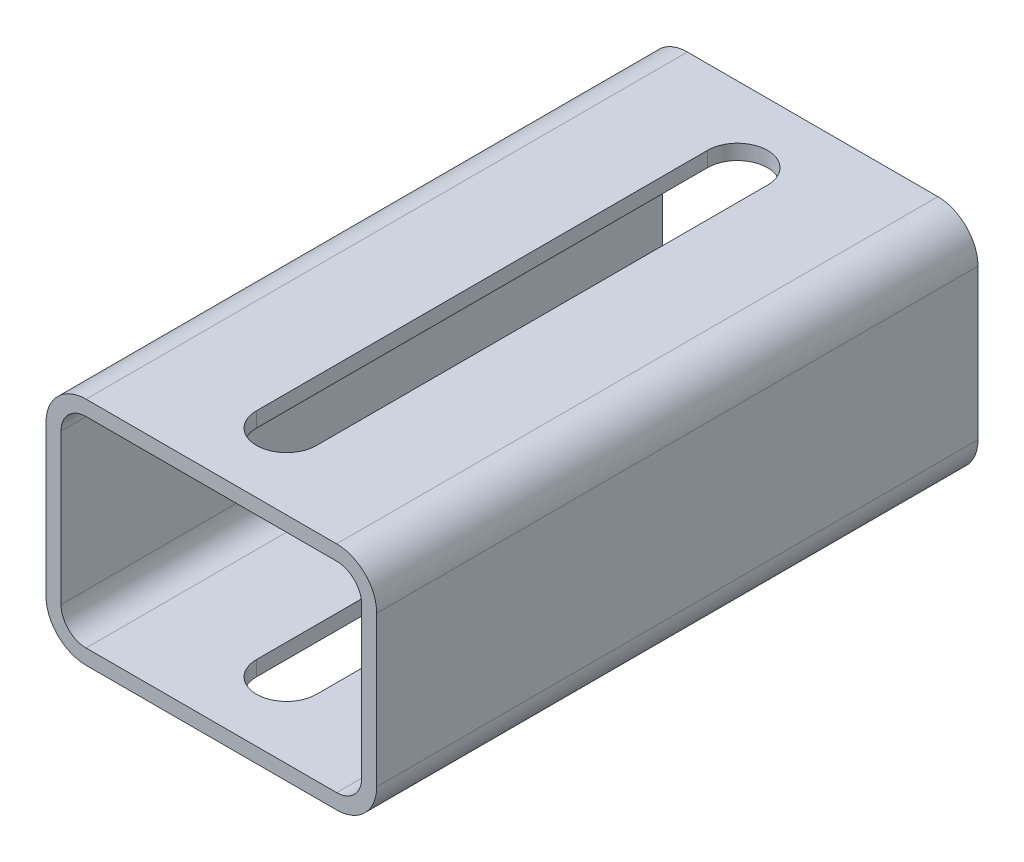
ISO-10303-21;
HEADER;
FILE_DESCRIPTION(('STEP AP214'),'2;1');
FILE_NAME('part.step','',(''),(''),'','','');
FILE_SCHEMA(('AUTOMOTIVE_DESIGN { 1 0 10303 214 1 1 1 1 }'));
ENDSEC;
DATA;
#1=APPLICATION_CONTEXT('core data for automotive mechanical design processes');
#2=APPLICATION_PROTOCOL_DEFINITION('international standard','automotive_design',2000,#1);
#3=PRODUCT_CONTEXT('',#1,'mechanical');
#4=PRODUCT('Part','Part','',(#3));
#5=PRODUCT_RELATED_PRODUCT_CATEGORY('part','',(#4));
#6=PRODUCT_DEFINITION_FORMATION('','',#4);
#7=PRODUCT_DEFINITION_CONTEXT('part definition',#1,'design');
#8=PRODUCT_DEFINITION('design','',#6,#7);
#9=PRODUCT_DEFINITION_SHAPE('','',#8);
#10=(LENGTH_UNIT() NAMED_UNIT(*) SI_UNIT(.MILLI.,.METRE.));
#11=(NAMED_UNIT(*) PLANE_ANGLE_UNIT() SI_UNIT($,.RADIAN.));
#12=(NAMED_UNIT(*) SI_UNIT($,.STERADIAN.) SOLID_ANGLE_UNIT());
#13=UNCERTAINTY_MEASURE_WITH_UNIT(LENGTH_MEASURE(1.E-05),#10,'distance_accuracy_value','');
#14=(GEOMETRIC_REPRESENTATION_CONTEXT(3) GLOBAL_UNCERTAINTY_ASSIGNED_CONTEXT((#13)) GLOBAL_UNIT_ASSIGNED_CONTEXT((#10,
#11,#12)) REPRESENTATION_CONTEXT('',''));
#15=CARTESIAN_POINT('',(0.,0.,0.));
#16=DIRECTION('',(0.,0.,1.));
#17=DIRECTION('',(1.,0.,0.));
#18=AXIS2_PLACEMENT_3D('',#15,#16,#17);
#19=CARTESIAN_POINT('',(-25.,-15.,60.));
#20=DIRECTION('',(0.,0.,1.));
#21=DIRECTION('',(1.,0.,0.));
#22=AXIS2_PLACEMENT_3D('',#19,#20,#21);
#23=PLANE('',#22);
#24=CARTESIAN_POINT('',(-25.,-15.,60.));
#25=DIRECTION('',(0.,0.,1.));
#26=DIRECTION('',(1.,0.,0.));
#27=AXIS2_PLACEMENT_3D('',#24,#25,#26);
#28=CIRCLE('',#27,8.);
#29=CARTESIAN_POINT('',(-33.,-15.,60.));
#30=VERTEX_POINT('',#29);
#31=CARTESIAN_POINT('',(-25.,-23.,60.));
#32=VERTEX_POINT('',#31);
#33=EDGE_CURVE('E402',#30,#32,#28,.T.);
#34=ORIENTED_EDGE('',*,*,#33,.T.);
#35=DIRECTION('',(1.,0.,0.));
#36=VECTOR('',#35,1.);
#37=CARTESIAN_POINT('',(-25.,-23.,60.));
#38=LINE('',#37,#36);
#39=CARTESIAN_POINT('',(25.,-23.,60.));
#40=VERTEX_POINT('',#39);
#41=EDGE_CURVE('E406',#32,#40,#38,.T.);
#42=ORIENTED_EDGE('',*,*,#41,.T.);
#43=CARTESIAN_POINT('',(25.,-15.,60.));
#44=DIRECTION('',(0.,0.,1.));
#45=DIRECTION('',(1.,0.,0.));
#46=AXIS2_PLACEMENT_3D('',#43,#44,#45);
#47=CIRCLE('',#46,8.);
#48=CARTESIAN_POINT('',(33.,-15.,60.));
#49=VERTEX_POINT('',#48);
#50=EDGE_CURVE('E410',#40,#49,#47,.T.);
#51=ORIENTED_EDGE('',*,*,#50,.T.);
#52=DIRECTION('',(0.,1.,0.));
#53=VECTOR('',#52,1.);
#54=CARTESIAN_POINT('',(33.,15.,60.));
#55=LINE('',#54,#53);
#56=CARTESIAN_POINT('',(33.,15.,60.));
#57=VERTEX_POINT('',#56);
#58=EDGE_CURVE('E413',#49,#57,#55,.T.);
#59=ORIENTED_EDGE('',*,*,#58,.T.);
#60=CARTESIAN_POINT('',(25.,15.,60.));
#61=DIRECTION('',(0.,0.,1.));
#62=DIRECTION('',(1.,0.,0.));
#63=AXIS2_PLACEMENT_3D('',#60,#61,#62);
#64=CIRCLE('',#63,8.);
#65=CARTESIAN_POINT('',(24.9999999999999,23.,60.));
#66=VERTEX_POINT('',#65);
#67=EDGE_CURVE('E416',#57,#66,#64,.T.);
#68=ORIENTED_EDGE('',*,*,#67,.T.);
#69=DIRECTION('',(-1.,0.,0.));
#70=VECTOR('',#69,1.);
#71=CARTESIAN_POINT('',(-25.,23.,60.));
#72=LINE('',#71,#70);
#73=CARTESIAN_POINT('',(-25.,23.,60.));
#74=VERTEX_POINT('',#73);
#75=EDGE_CURVE('E419',#66,#74,#72,.T.);
#76=ORIENTED_EDGE('',*,*,#75,.T.);
#77=CARTESIAN_POINT('',(-25.,15.,60.));
#78=DIRECTION('',(0.,0.,1.));
#79=DIRECTION('',(1.,0.,0.));
#80=AXIS2_PLACEMENT_3D('',#77,#78,#79);
#81=CIRCLE('',#80,8.);
#82=CARTESIAN_POINT('',(-33.,14.9999999999999,60.));
#83=VERTEX_POINT('',#82);
#84=EDGE_CURVE('E422',#74,#83,#81,.T.);
#85=ORIENTED_EDGE('',*,*,#84,.T.);
#86=DIRECTION('',(0.,-1.,0.));
#87=VECTOR('',#86,1.);
#88=CARTESIAN_POINT('',(-33.,15.,60.));
#89=LINE('',#88,#87);
#90=EDGE_CURVE('E425',#83,#30,#89,.T.);
#91=ORIENTED_EDGE('',*,*,#90,.T.);
#92=EDGE_LOOP('',(#34,#42,#51,#59,#68,#76,#85,#91));
#93=FACE_BOUND('',#92,.T.);
#94=DIRECTION('',(1.,0.,0.));
#95=VECTOR('',#94,1.);
#96=CARTESIAN_POINT('',(-25.,-20.,60.));
#97=LINE('',#96,#95);
#98=CARTESIAN_POINT('',(-25.,-20.,60.));
#99=VERTEX_POINT('',#98);
#100=CARTESIAN_POINT('',(25.,-20.,60.));
#101=VERTEX_POINT('',#100);
#102=EDGE_CURVE('E322',#99,#101,#97,.T.);
#103=ORIENTED_EDGE('',*,*,#102,.F.);
#104=CARTESIAN_POINT('',(-25.,-15.,60.));
#105=DIRECTION('',(0.,0.,1.));
#106=DIRECTION('',(1.,0.,0.));
#107=AXIS2_PLACEMENT_3D('',#104,#105,#106);
#108=CIRCLE('',#107,5.);
#109=CARTESIAN_POINT('',(-30.,-15.,60.));
#110=VERTEX_POINT('',#109);
#111=EDGE_CURVE('E319',#110,#99,#108,.T.);
#112=ORIENTED_EDGE('',*,*,#111,.F.);
#113=DIRECTION('',(0.,-1.,0.));
#114=VECTOR('',#113,1.);
#115=CARTESIAN_POINT('',(-30.,15.,60.));
#116=LINE('',#115,#114);
#117=CARTESIAN_POINT('',(-30.,15.,60.));
#118=VERTEX_POINT('',#117);
#119=EDGE_CURVE('E342',#118,#110,#116,.T.);
#120=ORIENTED_EDGE('',*,*,#119,.F.);
#121=CARTESIAN_POINT('',(-25.,15.,60.));
#122=DIRECTION('',(0.,0.,1.));
#123=DIRECTION('',(1.,0.,0.));
#124=AXIS2_PLACEMENT_3D('',#121,#122,#123);
#125=CIRCLE('',#124,5.);
#126=CARTESIAN_POINT('',(-25.,20.,60.));
#127=VERTEX_POINT('',#126);
#128=EDGE_CURVE('E338',#127,#118,#125,.T.);
#129=ORIENTED_EDGE('',*,*,#128,.F.);
#130=DIRECTION('',(-1.,0.,0.));
#131=VECTOR('',#130,1.);
#132=CARTESIAN_POINT('',(-25.,20.,60.));
#133=LINE('',#132,#131);
#134=CARTESIAN_POINT('',(25.,20.,60.));
#135=VERTEX_POINT('',#134);
#136=EDGE_CURVE('E335',#135,#127,#133,.T.);
#137=ORIENTED_EDGE('',*,*,#136,.F.);
#138=CARTESIAN_POINT('',(25.,15.,60.));
#139=DIRECTION('',(0.,0.,1.));
#140=DIRECTION('',(-1.,0.,0.));
#141=AXIS2_PLACEMENT_3D('',#138,#139,#140);
#142=CIRCLE('',#141,5.);
#143=CARTESIAN_POINT('',(30.,15.,60.));
#144=VERTEX_POINT('',#143);
#145=EDGE_CURVE('E332',#144,#135,#142,.T.);
#146=ORIENTED_EDGE('',*,*,#145,.F.);
#147=DIRECTION('',(0.,1.,0.));
#148=VECTOR('',#147,1.);
#149=CARTESIAN_POINT('',(30.,15.,60.));
#150=LINE('',#149,#148);
#151=CARTESIAN_POINT('',(30.,-15.,60.));
#152=VERTEX_POINT('',#151);
#153=EDGE_CURVE('E329',#152,#144,#150,.T.);
#154=ORIENTED_EDGE('',*,*,#153,.F.);
#155=CARTESIAN_POINT('',(25.,-15.,60.));
#156=DIRECTION('',(0.,0.,1.));
#157=DIRECTION('',(1.,0.,0.));
#158=AXIS2_PLACEMENT_3D('',#155,#156,#157);
#159=CIRCLE('',#158,5.);
#160=EDGE_CURVE('E326',#101,#152,#159,.T.);
#161=ORIENTED_EDGE('',*,*,#160,.F.);
#162=EDGE_LOOP('',(#103,#112,#120,#129,#137,#146,#154,#161));
#163=FACE_BOUND('',#162,.T.);
#164=ADVANCED_FACE('F86',(#93,#163),#23,.T.);
#165=CARTESIAN_POINT('',(-25.,-15.,-60.));
#166=DIRECTION('',(0.,0.,1.));
#167=DIRECTION('',(1.,0.,0.));
#168=AXIS2_PLACEMENT_3D('',#165,#166,#167);
#169=PLANE('',#168);
#170=CARTESIAN_POINT('',(-25.,-15.,-60.));
#171=DIRECTION('',(0.,0.,1.));
#172=DIRECTION('',(1.,0.,0.));
#173=AXIS2_PLACEMENT_3D('',#170,#171,#172);
#174=CIRCLE('',#173,8.);
#175=CARTESIAN_POINT('',(-33.,-15.,-60.));
#176=VERTEX_POINT('',#175);
#177=CARTESIAN_POINT('',(-25.,-23.,-60.));
#178=VERTEX_POINT('',#177);
#179=EDGE_CURVE('E401',#176,#178,#174,.T.);
#180=ORIENTED_EDGE('',*,*,#179,.F.);
#181=DIRECTION('',(0.,-1.,0.));
#182=VECTOR('',#181,1.);
#183=CARTESIAN_POINT('',(-33.,15.,-60.));
#184=LINE('',#183,#182);
#185=CARTESIAN_POINT('',(-33.,14.9999999999999,-60.));
#186=VERTEX_POINT('',#185);
#187=EDGE_CURVE('E407',#186,#176,#184,.T.);
#188=ORIENTED_EDGE('',*,*,#187,.F.);
#189=CARTESIAN_POINT('',(-25.,15.,-60.));
#190=DIRECTION('',(0.,0.,1.));
#191=DIRECTION('',(1.,0.,0.));
#192=AXIS2_PLACEMENT_3D('',#189,#190,#191);
#193=CIRCLE('',#192,8.);
#194=CARTESIAN_POINT('',(-25.,23.,-60.));
#195=VERTEX_POINT('',#194);
#196=EDGE_CURVE('E447',#195,#186,#193,.T.);
#197=ORIENTED_EDGE('',*,*,#196,.F.);
#198=DIRECTION('',(-1.,0.,0.));
#199=VECTOR('',#198,1.);
#200=CARTESIAN_POINT('',(-25.,23.,-60.));
#201=LINE('',#200,#199);
#202=CARTESIAN_POINT('',(24.9999999999999,23.,-60.));
#203=VERTEX_POINT('',#202);
#204=EDGE_CURVE('E444',#203,#195,#201,.T.);
#205=ORIENTED_EDGE('',*,*,#204,.F.);
#206=CARTESIAN_POINT('',(25.,15.,-60.));
#207=DIRECTION('',(0.,0.,1.));
#208=DIRECTION('',(1.,0.,0.));
#209=AXIS2_PLACEMENT_3D('',#206,#207,#208);
#210=CIRCLE('',#209,8.);
#211=CARTESIAN_POINT('',(33.,15.,-60.));
#212=VERTEX_POINT('',#211);
#213=EDGE_CURVE('E441',#212,#203,#210,.T.);
#214=ORIENTED_EDGE('',*,*,#213,.F.);
#215=DIRECTION('',(0.,1.,0.));
#216=VECTOR('',#215,1.);
#217=CARTESIAN_POINT('',(33.,15.,-60.));
#218=LINE('',#217,#216);
#219=CARTESIAN_POINT('',(33.,-15.,-60.));
#220=VERTEX_POINT('',#219);
#221=EDGE_CURVE('E438',#220,#212,#218,.T.);
#222=ORIENTED_EDGE('',*,*,#221,.F.);
#223=CARTESIAN_POINT('',(25.,-15.,-60.));
#224=DIRECTION('',(0.,0.,1.));
#225=DIRECTION('',(1.,0.,0.));
#226=AXIS2_PLACEMENT_3D('',#223,#224,#225);
#227=CIRCLE('',#226,8.);
#228=CARTESIAN_POINT('',(25.,-23.,-60.));
#229=VERTEX_POINT('',#228);
#230=EDGE_CURVE('E435',#229,#220,#227,.T.);
#231=ORIENTED_EDGE('',*,*,#230,.F.);
#232=DIRECTION('',(1.,0.,0.));
#233=VECTOR('',#232,1.);
#234=CARTESIAN_POINT('',(-25.,-23.,-60.));
#235=LINE('',#234,#233);
#236=EDGE_CURVE('E432',#178,#229,#235,.T.);
#237=ORIENTED_EDGE('',*,*,#236,.F.);
#238=EDGE_LOOP('',(#180,#188,#197,#205,#214,#222,#231,#237));
#239=FACE_BOUND('',#238,.T.);
#240=CARTESIAN_POINT('',(-25.,-15.,-60.));
#241=DIRECTION('',(0.,0.,1.));
#242=DIRECTION('',(1.,0.,0.));
#243=AXIS2_PLACEMENT_3D('',#240,#241,#242);
#244=CIRCLE('',#243,5.);
#245=CARTESIAN_POINT('',(-30.,-15.,-60.));
#246=VERTEX_POINT('',#245);
#247=CARTESIAN_POINT('',(-25.,-20.,-60.));
#248=VERTEX_POINT('',#247);
#249=EDGE_CURVE('E318',#246,#248,#244,.T.);
#250=ORIENTED_EDGE('',*,*,#249,.T.);
#251=DIRECTION('',(1.,0.,0.));
#252=VECTOR('',#251,1.);
#253=CARTESIAN_POINT('',(-25.,-20.,-60.));
#254=LINE('',#253,#252);
#255=CARTESIAN_POINT('',(25.,-20.,-60.));
#256=VERTEX_POINT('',#255);
#257=EDGE_CURVE('E349',#248,#256,#254,.T.);
#258=ORIENTED_EDGE('',*,*,#257,.T.);
#259=CARTESIAN_POINT('',(25.,-15.,-60.));
#260=DIRECTION('',(0.,0.,1.));
#261=DIRECTION('',(1.,0.,0.));
#262=AXIS2_PLACEMENT_3D('',#259,#260,#261);
#263=CIRCLE('',#262,5.);
#264=CARTESIAN_POINT('',(30.,-15.,-60.));
#265=VERTEX_POINT('',#264);
#266=EDGE_CURVE('E353',#256,#265,#263,.T.);
#267=ORIENTED_EDGE('',*,*,#266,.T.);
#268=DIRECTION('',(0.,1.,0.));
#269=VECTOR('',#268,1.);
#270=CARTESIAN_POINT('',(30.,15.,-60.));
#271=LINE('',#270,#269);
#272=CARTESIAN_POINT('',(30.,15.,-60.));
#273=VERTEX_POINT('',#272);
#274=EDGE_CURVE('E357',#265,#273,#271,.T.);
#275=ORIENTED_EDGE('',*,*,#274,.T.);
#276=CARTESIAN_POINT('',(25.,15.,-60.));
#277=DIRECTION('',(0.,0.,1.));
#278=DIRECTION('',(-1.,0.,0.));
#279=AXIS2_PLACEMENT_3D('',#276,#277,#278);
#280=CIRCLE('',#279,5.);
#281=CARTESIAN_POINT('',(25.,20.,-60.));
#282=VERTEX_POINT('',#281);
#283=EDGE_CURVE('E361',#273,#282,#280,.T.);
#284=ORIENTED_EDGE('',*,*,#283,.T.);
#285=DIRECTION('',(-1.,0.,0.));
#286=VECTOR('',#285,1.);
#287=CARTESIAN_POINT('',(-25.,20.,-60.));
#288=LINE('',#287,#286);
#289=CARTESIAN_POINT('',(-25.,20.,-60.));
#290=VERTEX_POINT('',#289);
#291=EDGE_CURVE('E365',#282,#290,#288,.T.);
#292=ORIENTED_EDGE('',*,*,#291,.T.);
#293=CARTESIAN_POINT('',(-25.,15.,-60.));
#294=DIRECTION('',(0.,0.,1.));
#295=DIRECTION('',(1.,0.,0.));
#296=AXIS2_PLACEMENT_3D('',#293,#294,#295);
#297=CIRCLE('',#296,5.);
#298=CARTESIAN_POINT('',(-30.,15.,-60.));
#299=VERTEX_POINT('',#298);
#300=EDGE_CURVE('E369',#290,#299,#297,.T.);
#301=ORIENTED_EDGE('',*,*,#300,.T.);
#302=DIRECTION('',(0.,-1.,0.));
#303=VECTOR('',#302,1.);
#304=CARTESIAN_POINT('',(-30.,15.,-60.));
#305=LINE('',#304,#303);
#306=EDGE_CURVE('E323',#299,#246,#305,.T.);
#307=ORIENTED_EDGE('',*,*,#306,.T.);
#308=EDGE_LOOP('',(#250,#258,#267,#275,#284,#292,#301,#307));
#309=FACE_BOUND('',#308,.T.);
#310=ADVANCED_FACE('F532',(#239,#309),#169,.F.);
#311=CARTESIAN_POINT('',(-25.,-15.,60.));
#312=DIRECTION('',(0.,0.,-1.));
#313=DIRECTION('',(-1.,0.,0.));
#314=AXIS2_PLACEMENT_3D('',#311,#312,#313);
#315=CYLINDRICAL_SURFACE('',#314,8.);
#316=ORIENTED_EDGE('',*,*,#179,.T.);
#317=DIRECTION('',(0.,0.,-1.));
#318=VECTOR('',#317,1.);
#319=CARTESIAN_POINT('',(-25.,-23.,60.));
#320=LINE('',#319,#318);
#321=EDGE_CURVE('E479',#32,#178,#320,.T.);
#322=ORIENTED_EDGE('',*,*,#321,.F.);
#323=ORIENTED_EDGE('',*,*,#33,.F.);
#324=DIRECTION('',(0.,0.,-1.));
#325=VECTOR('',#324,1.);
#326=CARTESIAN_POINT('',(-33.,-15.,60.));
#327=LINE('',#326,#325);
#328=EDGE_CURVE('E428',#30,#176,#327,.T.);
#329=ORIENTED_EDGE('',*,*,#328,.T.);
#330=EDGE_LOOP('',(#316,#322,#323,#329));
#331=FACE_BOUND('',#330,.T.);
#332=ADVANCED_FACE('F88',(#331),#315,.T.);
#333=CARTESIAN_POINT('',(-25.,-23.,60.));
#334=DIRECTION('',(0.,1.,0.));
#335=DIRECTION('',(0.,0.,1.));
#336=AXIS2_PLACEMENT_3D('',#333,#334,#335);
#337=PLANE('',#336);
#338=DIRECTION('',(0.,0.,-1.));
#339=VECTOR('',#338,1.);
#340=CARTESIAN_POINT('',(5.99999999999998,-23.,-45.));
#341=LINE('',#340,#339);
#342=CARTESIAN_POINT('',(5.99999999999998,-23.,45.));
#343=VERTEX_POINT('',#342);
#344=CARTESIAN_POINT('',(5.99999999999998,-23.,-45.));
#345=VERTEX_POINT('',#344);
#346=EDGE_CURVE('E274',#343,#345,#341,.T.);
#347=ORIENTED_EDGE('',*,*,#346,.T.);
#348=CARTESIAN_POINT('',(0.,-23.,-45.));
#349=DIRECTION('',(0.,1.,0.));
#350=DIRECTION('',(0.,0.,1.));
#351=AXIS2_PLACEMENT_3D('',#348,#349,#350);
#352=CIRCLE('',#351,6.);
#353=CARTESIAN_POINT('',(-6.00000000000002,-23.,-45.));
#354=VERTEX_POINT('',#353);
#355=EDGE_CURVE('E254',#345,#354,#352,.T.);
#356=ORIENTED_EDGE('',*,*,#355,.T.);
#357=DIRECTION('',(0.,0.,1.));
#358=VECTOR('',#357,1.);
#359=CARTESIAN_POINT('',(-6.00000000000002,-23.,-45.));
#360=LINE('',#359,#358);
#361=CARTESIAN_POINT('',(-6.00000000000002,-23.,45.));
#362=VERTEX_POINT('',#361);
#363=EDGE_CURVE('E265',#354,#362,#360,.T.);
#364=ORIENTED_EDGE('',*,*,#363,.T.);
#365=CARTESIAN_POINT('',(0.,-23.,45.));
#366=DIRECTION('',(0.,1.,0.));
#367=DIRECTION('',(0.,0.,1.));
#368=AXIS2_PLACEMENT_3D('',#365,#366,#367);
#369=CIRCLE('',#368,6.);
#370=EDGE_CURVE('E102',#362,#343,#369,.T.);
#371=ORIENTED_EDGE('',*,*,#370,.T.);
#372=EDGE_LOOP('',(#347,#356,#364,#371));
#373=FACE_BOUND('',#372,.T.);
#374=ORIENTED_EDGE('',*,*,#236,.T.);
#375=DIRECTION('',(0.,0.,-1.));
#376=VECTOR('',#375,1.);
#377=CARTESIAN_POINT('',(25.,-23.,60.));
#378=LINE('',#377,#376);
#379=EDGE_CURVE('E475',#40,#229,#378,.T.);
#380=ORIENTED_EDGE('',*,*,#379,.F.);
#381=ORIENTED_EDGE('',*,*,#41,.F.);
#382=ORIENTED_EDGE('',*,*,#321,.T.);
#383=EDGE_LOOP('',(#374,#380,#381,#382));
#384=FACE_BOUND('',#383,.T.);
#385=ADVANCED_FACE('F271',(#373,#384),#337,.F.);
#386=CARTESIAN_POINT('',(25.,-15.,60.));
#387=DIRECTION('',(0.,0.,-1.));
#388=DIRECTION('',(-1.,0.,0.));
#389=AXIS2_PLACEMENT_3D('',#386,#387,#388);
#390=CYLINDRICAL_SURFACE('',#389,8.);
#391=ORIENTED_EDGE('',*,*,#230,.T.);
#392=DIRECTION('',(0.,0.,-1.));
#393=VECTOR('',#392,1.);
#394=CARTESIAN_POINT('',(33.,-15.,60.));
#395=LINE('',#394,#393);
#396=EDGE_CURVE('E471',#49,#220,#395,.T.);
#397=ORIENTED_EDGE('',*,*,#396,.F.);
#398=ORIENTED_EDGE('',*,*,#50,.F.);
#399=ORIENTED_EDGE('',*,*,#379,.T.);
#400=EDGE_LOOP('',(#391,#397,#398,#399));
#401=FACE_BOUND('',#400,.T.);
#402=ADVANCED_FACE('F555',(#401),#390,.T.);
#403=CARTESIAN_POINT('',(33.,15.,60.));
#404=DIRECTION('',(-1.,0.,0.));
#405=DIRECTION('',(0.,-1.,0.));
#406=AXIS2_PLACEMENT_3D('',#403,#404,#405);
#407=PLANE('',#406);
#408=ORIENTED_EDGE('',*,*,#221,.T.);
#409=DIRECTION('',(0.,0.,-1.));
#410=VECTOR('',#409,1.);
#411=CARTESIAN_POINT('',(33.,15.,60.));
#412=LINE('',#411,#410);
#413=EDGE_CURVE('E467',#57,#212,#412,.T.);
#414=ORIENTED_EDGE('',*,*,#413,.F.);
#415=ORIENTED_EDGE('',*,*,#58,.F.);
#416=ORIENTED_EDGE('',*,*,#396,.T.);
#417=EDGE_LOOP('',(#408,#414,#415,#416));
#418=FACE_BOUND('',#417,.T.);
#419=ADVANCED_FACE('F551',(#418),#407,.F.);
#420=CARTESIAN_POINT('',(25.,15.,60.));
#421=DIRECTION('',(0.,0.,-1.));
#422=DIRECTION('',(-1.,0.,0.));
#423=AXIS2_PLACEMENT_3D('',#420,#421,#422);
#424=CYLINDRICAL_SURFACE('',#423,8.);
#425=ORIENTED_EDGE('',*,*,#213,.T.);
#426=DIRECTION('',(0.,0.,-1.));
#427=VECTOR('',#426,1.);
#428=CARTESIAN_POINT('',(24.9999999999999,23.,60.));
#429=LINE('',#428,#427);
#430=EDGE_CURVE('E463',#66,#203,#429,.T.);
#431=ORIENTED_EDGE('',*,*,#430,.F.);
#432=ORIENTED_EDGE('',*,*,#67,.F.);
#433=ORIENTED_EDGE('',*,*,#413,.T.);
#434=EDGE_LOOP('',(#425,#431,#432,#433));
#435=FACE_BOUND('',#434,.T.);
#436=ADVANCED_FACE('F518',(#435),#424,.T.);
#437=CARTESIAN_POINT('',(-25.,23.,60.));
#438=DIRECTION('',(0.,-1.,0.));
#439=DIRECTION('',(0.,0.,-1.));
#440=AXIS2_PLACEMENT_3D('',#437,#438,#439);
#441=PLANE('',#440);
#442=DIRECTION('',(0.,0.,1.));
#443=VECTOR('',#442,1.);
#444=CARTESIAN_POINT('',(-6.00000000000002,23.,-45.));
#445=LINE('',#444,#443);
#446=CARTESIAN_POINT('',(-6.00000000000002,23.,-45.));
#447=VERTEX_POINT('',#446);
#448=CARTESIAN_POINT('',(-5.99999999999999,23.,45.));
#449=VERTEX_POINT('',#448);
#450=EDGE_CURVE('E289',#447,#449,#445,.T.);
#451=ORIENTED_EDGE('',*,*,#450,.F.);
#452=CARTESIAN_POINT('',(0.,23.,-45.));
#453=DIRECTION('',(0.,1.,0.));
#454=DIRECTION('',(0.,0.,1.));
#455=AXIS2_PLACEMENT_3D('',#452,#453,#454);
#456=CIRCLE('',#455,6.);
#457=CARTESIAN_POINT('',(5.99999999999998,23.,-45.));
#458=VERTEX_POINT('',#457);
#459=EDGE_CURVE('E110',#458,#447,#456,.T.);
#460=ORIENTED_EDGE('',*,*,#459,.F.);
#461=DIRECTION('',(0.,0.,-1.));
#462=VECTOR('',#461,1.);
#463=CARTESIAN_POINT('',(5.99999999999998,23.,-45.));
#464=LINE('',#463,#462);
#465=CARTESIAN_POINT('',(5.99999999999998,23.,45.));
#466=VERTEX_POINT('',#465);
#467=EDGE_CURVE('E276',#466,#458,#464,.T.);
#468=ORIENTED_EDGE('',*,*,#467,.F.);
#469=CARTESIAN_POINT('',(0.,23.,45.));
#470=DIRECTION('',(0.,1.,0.));
#471=DIRECTION('',(0.,0.,1.));
#472=AXIS2_PLACEMENT_3D('',#469,#470,#471);
#473=CIRCLE('',#472,6.);
#474=EDGE_CURVE('E280',#449,#466,#473,.T.);
#475=ORIENTED_EDGE('',*,*,#474,.F.);
#476=EDGE_LOOP('',(#451,#460,#468,#475));
#477=FACE_BOUND('',#476,.T.);
#478=ORIENTED_EDGE('',*,*,#204,.T.);
#479=DIRECTION('',(0.,0.,-1.));
#480=VECTOR('',#479,1.);
#481=CARTESIAN_POINT('',(-25.,23.,60.));
#482=LINE('',#481,#480);
#483=EDGE_CURVE('E459',#74,#195,#482,.T.);
#484=ORIENTED_EDGE('',*,*,#483,.F.);
#485=ORIENTED_EDGE('',*,*,#75,.F.);
#486=ORIENTED_EDGE('',*,*,#430,.T.);
#487=EDGE_LOOP('',(#478,#484,#485,#486));
#488=FACE_BOUND('',#487,.T.);
#489=ADVANCED_FACE('F514',(#477,#488),#441,.F.);
#490=CARTESIAN_POINT('',(-25.,15.,60.));
#491=DIRECTION('',(0.,0.,-1.));
#492=DIRECTION('',(-1.,0.,0.));
#493=AXIS2_PLACEMENT_3D('',#490,#491,#492);
#494=CYLINDRICAL_SURFACE('',#493,8.);
#495=ORIENTED_EDGE('',*,*,#196,.T.);
#496=DIRECTION('',(0.,0.,-1.));
#497=VECTOR('',#496,1.);
#498=CARTESIAN_POINT('',(-33.,14.9999999999999,60.));
#499=LINE('',#498,#497);
#500=EDGE_CURVE('E455',#83,#186,#499,.T.);
#501=ORIENTED_EDGE('',*,*,#500,.F.);
#502=ORIENTED_EDGE('',*,*,#84,.F.);
#503=ORIENTED_EDGE('',*,*,#483,.T.);
#504=EDGE_LOOP('',(#495,#501,#502,#503));
#505=FACE_BOUND('',#504,.T.);
#506=ADVANCED_FACE('F517',(#505),#494,.T.);
#507=CARTESIAN_POINT('',(-33.,15.,60.));
#508=DIRECTION('',(1.,0.,0.));
#509=DIRECTION('',(0.,0.,-1.));
#510=AXIS2_PLACEMENT_3D('',#507,#508,#509);
#511=PLANE('',#510);
#512=ORIENTED_EDGE('',*,*,#187,.T.);
#513=ORIENTED_EDGE('',*,*,#328,.F.);
#514=ORIENTED_EDGE('',*,*,#90,.F.);
#515=ORIENTED_EDGE('',*,*,#500,.T.);
#516=EDGE_LOOP('',(#512,#513,#514,#515));
#517=FACE_BOUND('',#516,.T.);
#518=ADVANCED_FACE('F536',(#517),#511,.F.);
#519=CARTESIAN_POINT('',(-25.,-15.,60.));
#520=DIRECTION('',(0.,0.,-1.));
#521=DIRECTION('',(-1.,0.,0.));
#522=AXIS2_PLACEMENT_3D('',#519,#520,#521);
#523=CYLINDRICAL_SURFACE('',#522,5.);
#524=ORIENTED_EDGE('',*,*,#249,.F.);
#525=DIRECTION('',(0.,0.,-1.));
#526=VECTOR('',#525,1.);
#527=CARTESIAN_POINT('',(-30.,-15.,60.));
#528=LINE('',#527,#526);
#529=EDGE_CURVE('E345',#110,#246,#528,.T.);
#530=ORIENTED_EDGE('',*,*,#529,.F.);
#531=ORIENTED_EDGE('',*,*,#111,.T.);
#532=DIRECTION('',(0.,0.,-1.));
#533=VECTOR('',#532,1.);
#534=CARTESIAN_POINT('',(-25.,-20.,60.));
#535=LINE('',#534,#533);
#536=EDGE_CURVE('E397',#99,#248,#535,.T.);
#537=ORIENTED_EDGE('',*,*,#536,.T.);
#538=EDGE_LOOP('',(#524,#530,#531,#537));
#539=FACE_BOUND('',#538,.T.);
#540=ADVANCED_FACE('F569',(#539),#523,.F.);
#541=CARTESIAN_POINT('',(-25.,-20.,60.));
#542=DIRECTION('',(0.,1.,0.));
#543=DIRECTION('',(0.,0.,1.));
#544=AXIS2_PLACEMENT_3D('',#541,#542,#543);
#545=PLANE('',#544);
#546=CARTESIAN_POINT('',(0.,-20.,-45.));
#547=DIRECTION('',(0.,1.,0.));
#548=DIRECTION('',(0.,0.,1.));
#549=AXIS2_PLACEMENT_3D('',#546,#547,#548);
#550=CIRCLE('',#549,6.);
#551=CARTESIAN_POINT('',(5.99999999999998,-20.,-45.));
#552=VERTEX_POINT('',#551);
#553=CARTESIAN_POINT('',(-6.00000000000002,-20.,-45.));
#554=VERTEX_POINT('',#553);
#555=EDGE_CURVE('E257',#552,#554,#550,.T.);
#556=ORIENTED_EDGE('',*,*,#555,.F.);
#557=DIRECTION('',(0.,0.,-1.));
#558=VECTOR('',#557,1.);
#559=CARTESIAN_POINT('',(5.99999999999998,-20.,60.));
#560=LINE('',#559,#558);
#561=CARTESIAN_POINT('',(5.99999999999998,-20.,45.));
#562=VERTEX_POINT('',#561);
#563=EDGE_CURVE('E313',#562,#552,#560,.T.);
#564=ORIENTED_EDGE('',*,*,#563,.F.);
#565=CARTESIAN_POINT('',(0.,-20.,45.));
#566=DIRECTION('',(0.,1.,0.));
#567=DIRECTION('',(0.,0.,1.));
#568=AXIS2_PLACEMENT_3D('',#565,#566,#567);
#569=CIRCLE('',#568,6.);
#570=CARTESIAN_POINT('',(-5.99999999999999,-20.,45.));
#571=VERTEX_POINT('',#570);
#572=EDGE_CURVE('E310',#571,#562,#569,.T.);
#573=ORIENTED_EDGE('',*,*,#572,.F.);
#574=DIRECTION('',(0.,0.,1.));
#575=VECTOR('',#574,1.);
#576=CARTESIAN_POINT('',(-6.00000000000002,-20.,60.));
#577=LINE('',#576,#575);
#578=EDGE_CURVE('E299',#554,#571,#577,.T.);
#579=ORIENTED_EDGE('',*,*,#578,.F.);
#580=EDGE_LOOP('',(#556,#564,#573,#579));
#581=FACE_BOUND('',#580,.T.);
#582=ORIENTED_EDGE('',*,*,#257,.F.);
#583=ORIENTED_EDGE('',*,*,#536,.F.);
#584=ORIENTED_EDGE('',*,*,#102,.T.);
#585=DIRECTION('',(0.,0.,-1.));
#586=VECTOR('',#585,1.);
#587=CARTESIAN_POINT('',(25.,-20.,60.));
#588=LINE('',#587,#586);
#589=EDGE_CURVE('E394',#101,#256,#588,.T.);
#590=ORIENTED_EDGE('',*,*,#589,.T.);
#591=EDGE_LOOP('',(#582,#583,#584,#590));
#592=FACE_BOUND('',#591,.T.);
#593=ADVANCED_FACE('F606',(#581,#592),#545,.T.);
#594=CARTESIAN_POINT('',(25.,-15.,60.));
#595=DIRECTION('',(0.,0.,-1.));
#596=DIRECTION('',(-1.,0.,0.));
#597=AXIS2_PLACEMENT_3D('',#594,#595,#596);
#598=CYLINDRICAL_SURFACE('',#597,5.);
#599=ORIENTED_EDGE('',*,*,#266,.F.);
#600=ORIENTED_EDGE('',*,*,#589,.F.);
#601=ORIENTED_EDGE('',*,*,#160,.T.);
#602=DIRECTION('',(0.,0.,-1.));
#603=VECTOR('',#602,1.);
#604=CARTESIAN_POINT('',(30.,-15.,60.));
#605=LINE('',#604,#603);
#606=EDGE_CURVE('E391',#152,#265,#605,.T.);
#607=ORIENTED_EDGE('',*,*,#606,.T.);
#608=EDGE_LOOP('',(#599,#600,#601,#607));
#609=FACE_BOUND('',#608,.T.);
#610=ADVANCED_FACE('F613',(#609),#598,.F.);
#611=CARTESIAN_POINT('',(30.,15.,60.));
#612=DIRECTION('',(-1.,0.,0.));
#613=DIRECTION('',(0.,-1.,0.));
#614=AXIS2_PLACEMENT_3D('',#611,#612,#613);
#615=PLANE('',#614);
#616=ORIENTED_EDGE('',*,*,#274,.F.);
#617=ORIENTED_EDGE('',*,*,#606,.F.);
#618=ORIENTED_EDGE('',*,*,#153,.T.);
#619=DIRECTION('',(0.,0.,-1.));
#620=VECTOR('',#619,1.);
#621=CARTESIAN_POINT('',(30.,15.,60.));
#622=LINE('',#621,#620);
#623=EDGE_CURVE('E388',#144,#273,#622,.T.);
#624=ORIENTED_EDGE('',*,*,#623,.T.);
#625=EDGE_LOOP('',(#616,#617,#618,#624));
#626=FACE_BOUND('',#625,.T.);
#627=ADVANCED_FACE('F620',(#626),#615,.T.);
#628=CARTESIAN_POINT('',(25.,15.,60.));
#629=DIRECTION('',(0.,0.,-1.));
#630=DIRECTION('',(-1.,0.,0.));
#631=AXIS2_PLACEMENT_3D('',#628,#629,#630);
#632=CYLINDRICAL_SURFACE('',#631,5.);
#633=ORIENTED_EDGE('',*,*,#283,.F.);
#634=ORIENTED_EDGE('',*,*,#623,.F.);
#635=ORIENTED_EDGE('',*,*,#145,.T.);
#636=DIRECTION('',(0.,0.,-1.));
#637=VECTOR('',#636,1.);
#638=CARTESIAN_POINT('',(25.,20.,60.));
#639=LINE('',#638,#637);
#640=EDGE_CURVE('E385',#135,#282,#639,.T.);
#641=ORIENTED_EDGE('',*,*,#640,.T.);
#642=EDGE_LOOP('',(#633,#634,#635,#641));
#643=FACE_BOUND('',#642,.T.);
#644=ADVANCED_FACE('F628',(#643),#632,.F.);
#645=CARTESIAN_POINT('',(-25.,20.,60.));
#646=DIRECTION('',(0.,-1.,0.));
#647=DIRECTION('',(0.,0.,-1.));
#648=AXIS2_PLACEMENT_3D('',#645,#646,#647);
#649=PLANE('',#648);
#650=CARTESIAN_POINT('',(0.,20.,-45.));
#651=DIRECTION('',(0.,-1.,0.));
#652=DIRECTION('',(0.,0.,-1.));
#653=AXIS2_PLACEMENT_3D('',#650,#651,#652);
#654=CIRCLE('',#653,6.);
#655=CARTESIAN_POINT('',(-6.00000000000002,20.,-45.));
#656=VERTEX_POINT('',#655);
#657=CARTESIAN_POINT('',(5.99999999999998,20.,-45.));
#658=VERTEX_POINT('',#657);
#659=EDGE_CURVE('E12',#656,#658,#654,.T.);
#660=ORIENTED_EDGE('',*,*,#659,.F.);
#661=DIRECTION('',(0.,0.,-1.));
#662=VECTOR('',#661,1.);
#663=CARTESIAN_POINT('',(-6.00000000000002,20.,60.));
#664=LINE('',#663,#662);
#665=CARTESIAN_POINT('',(-6.00000000000002,20.,45.));
#666=VERTEX_POINT('',#665);
#667=EDGE_CURVE('E483',#666,#656,#664,.T.);
#668=ORIENTED_EDGE('',*,*,#667,.F.);
#669=CARTESIAN_POINT('',(0.,20.,45.));
#670=DIRECTION('',(0.,-1.,0.));
#671=DIRECTION('',(0.,0.,-1.));
#672=AXIS2_PLACEMENT_3D('',#669,#670,#671);
#673=CIRCLE('',#672,6.);
#674=CARTESIAN_POINT('',(5.99999999999998,20.,45.));
#675=VERTEX_POINT('',#674);
#676=EDGE_CURVE('E486',#675,#666,#673,.T.);
#677=ORIENTED_EDGE('',*,*,#676,.F.);
#678=DIRECTION('',(0.,0.,1.));
#679=VECTOR('',#678,1.);
#680=CARTESIAN_POINT('',(5.99999999999998,20.,60.));
#681=LINE('',#680,#679);
#682=EDGE_CURVE('E95',#658,#675,#681,.T.);
#683=ORIENTED_EDGE('',*,*,#682,.F.);
#684=EDGE_LOOP('',(#660,#668,#677,#683));
#685=FACE_BOUND('',#684,.T.);
#686=ORIENTED_EDGE('',*,*,#291,.F.);
#687=ORIENTED_EDGE('',*,*,#640,.F.);
#688=ORIENTED_EDGE('',*,*,#136,.T.);
#689=DIRECTION('',(0.,0.,-1.));
#690=VECTOR('',#689,1.);
#691=CARTESIAN_POINT('',(-25.,20.,60.));
#692=LINE('',#691,#690);
#693=EDGE_CURVE('E382',#127,#290,#692,.T.);
#694=ORIENTED_EDGE('',*,*,#693,.T.);
#695=EDGE_LOOP('',(#686,#687,#688,#694));
#696=FACE_BOUND('',#695,.T.);
#697=ADVANCED_FACE('F504',(#685,#696),#649,.T.);
#698=CARTESIAN_POINT('',(-25.,15.,60.));
#699=DIRECTION('',(0.,0.,-1.));
#700=DIRECTION('',(-1.,0.,0.));
#701=AXIS2_PLACEMENT_3D('',#698,#699,#700);
#702=CYLINDRICAL_SURFACE('',#701,5.);
#703=ORIENTED_EDGE('',*,*,#300,.F.);
#704=ORIENTED_EDGE('',*,*,#693,.F.);
#705=ORIENTED_EDGE('',*,*,#128,.T.);
#706=DIRECTION('',(0.,0.,-1.));
#707=VECTOR('',#706,1.);
#708=CARTESIAN_POINT('',(-30.,15.,60.));
#709=LINE('',#708,#707);
#710=EDGE_CURVE('E379',#118,#299,#709,.T.);
#711=ORIENTED_EDGE('',*,*,#710,.T.);
#712=EDGE_LOOP('',(#703,#704,#705,#711));
#713=FACE_BOUND('',#712,.T.);
#714=ADVANCED_FACE('F643',(#713),#702,.F.);
#715=CARTESIAN_POINT('',(-30.,15.,60.));
#716=DIRECTION('',(1.,0.,0.));
#717=DIRECTION('',(0.,0.,-1.));
#718=AXIS2_PLACEMENT_3D('',#715,#716,#717);
#719=PLANE('',#718);
#720=ORIENTED_EDGE('',*,*,#306,.F.);
#721=ORIENTED_EDGE('',*,*,#710,.F.);
#722=ORIENTED_EDGE('',*,*,#119,.T.);
#723=ORIENTED_EDGE('',*,*,#529,.T.);
#724=EDGE_LOOP('',(#720,#721,#722,#723));
#725=FACE_BOUND('',#724,.T.);
#726=ADVANCED_FACE('F650',(#725),#719,.T.);
#727=CARTESIAN_POINT('',(-6.00000000000002,-23.,-45.));
#728=DIRECTION('',(-1.,0.,0.));
#729=DIRECTION('',(0.,0.,1.));
#730=AXIS2_PLACEMENT_3D('',#727,#728,#729);
#731=PLANE('',#730);
#732=ORIENTED_EDGE('',*,*,#667,.T.);
#733=DIRECTION('',(0.,1.,0.));
#734=VECTOR('',#733,1.);
#735=CARTESIAN_POINT('',(-6.00000000000002,-23.,-45.));
#736=LINE('',#735,#734);
#737=EDGE_CURVE('E262',#656,#447,#736,.T.);
#738=ORIENTED_EDGE('',*,*,#737,.T.);
#739=ORIENTED_EDGE('',*,*,#450,.T.);
#740=DIRECTION('',(0.,1.,0.));
#741=VECTOR('',#740,1.);
#742=CARTESIAN_POINT('',(-5.99999999999999,-23.,45.));
#743=LINE('',#742,#741);
#744=EDGE_CURVE('E261',#666,#449,#743,.T.);
#745=ORIENTED_EDGE('',*,*,#744,.F.);
#746=EDGE_LOOP('',(#732,#738,#739,#745));
#747=FACE_BOUND('',#746,.T.);
#748=ADVANCED_FACE('F507',(#747),#731,.F.);
#749=CARTESIAN_POINT('',(0.,-23.,45.));
#750=DIRECTION('',(0.,1.,0.));
#751=DIRECTION('',(0.,0.,1.));
#752=AXIS2_PLACEMENT_3D('',#749,#750,#751);
#753=CYLINDRICAL_SURFACE('',#752,6.);
#754=ORIENTED_EDGE('',*,*,#676,.T.);
#755=ORIENTED_EDGE('',*,*,#744,.T.);
#756=ORIENTED_EDGE('',*,*,#474,.T.);
#757=DIRECTION('',(0.,1.,0.));
#758=VECTOR('',#757,1.);
#759=CARTESIAN_POINT('',(5.99999999999998,-23.,45.));
#760=LINE('',#759,#758);
#761=EDGE_CURVE('E305',#675,#466,#760,.T.);
#762=ORIENTED_EDGE('',*,*,#761,.F.);
#763=EDGE_LOOP('',(#754,#755,#756,#762));
#764=FACE_BOUND('',#763,.T.);
#765=ADVANCED_FACE('F499',(#764),#753,.F.);
#766=CARTESIAN_POINT('',(5.99999999999998,-23.,-45.));
#767=DIRECTION('',(1.,0.,0.));
#768=DIRECTION('',(0.,0.,-1.));
#769=AXIS2_PLACEMENT_3D('',#766,#767,#768);
#770=PLANE('',#769);
#771=ORIENTED_EDGE('',*,*,#682,.T.);
#772=ORIENTED_EDGE('',*,*,#761,.T.);
#773=ORIENTED_EDGE('',*,*,#467,.T.);
#774=DIRECTION('',(0.,1.,0.));
#775=VECTOR('',#774,1.);
#776=CARTESIAN_POINT('',(5.99999999999998,-23.,-45.));
#777=LINE('',#776,#775);
#778=EDGE_CURVE('E300',#658,#458,#777,.T.);
#779=ORIENTED_EDGE('',*,*,#778,.F.);
#780=EDGE_LOOP('',(#771,#772,#773,#779));
#781=FACE_BOUND('',#780,.T.);
#782=ADVANCED_FACE('F494',(#781),#770,.F.);
#783=CARTESIAN_POINT('',(0.,-23.,-45.));
#784=DIRECTION('',(0.,1.,0.));
#785=DIRECTION('',(0.,0.,1.));
#786=AXIS2_PLACEMENT_3D('',#783,#784,#785);
#787=CYLINDRICAL_SURFACE('',#786,6.);
#788=ORIENTED_EDGE('',*,*,#659,.T.);
#789=ORIENTED_EDGE('',*,*,#778,.T.);
#790=ORIENTED_EDGE('',*,*,#459,.T.);
#791=ORIENTED_EDGE('',*,*,#737,.F.);
#792=EDGE_LOOP('',(#788,#789,#790,#791));
#793=FACE_BOUND('',#792,.T.);
#794=ADVANCED_FACE('F509',(#793),#787,.F.);
#795=ORIENTED_EDGE('',*,*,#555,.T.);
#796=EDGE_CURVE('E249',#354,#554,#736,.T.);
#797=ORIENTED_EDGE('',*,*,#796,.F.);
#798=ORIENTED_EDGE('',*,*,#355,.F.);
#799=EDGE_CURVE('E296',#345,#552,#777,.T.);
#800=ORIENTED_EDGE('',*,*,#799,.T.);
#801=EDGE_LOOP('',(#795,#797,#798,#800));
#802=FACE_BOUND('',#801,.T.);
#803=ADVANCED_FACE('F251',(#802),#787,.F.);
#804=ORIENTED_EDGE('',*,*,#563,.T.);
#805=ORIENTED_EDGE('',*,*,#799,.F.);
#806=ORIENTED_EDGE('',*,*,#346,.F.);
#807=EDGE_CURVE('E301',#343,#562,#760,.T.);
#808=ORIENTED_EDGE('',*,*,#807,.T.);
#809=EDGE_LOOP('',(#804,#805,#806,#808));
#810=FACE_BOUND('',#809,.T.);
#811=ADVANCED_FACE('F678',(#810),#770,.F.);
#812=ORIENTED_EDGE('',*,*,#572,.T.);
#813=ORIENTED_EDGE('',*,*,#807,.F.);
#814=ORIENTED_EDGE('',*,*,#370,.F.);
#815=EDGE_CURVE('E267',#362,#571,#743,.T.);
#816=ORIENTED_EDGE('',*,*,#815,.T.);
#817=EDGE_LOOP('',(#812,#813,#814,#816));
#818=FACE_BOUND('',#817,.T.);
#819=ADVANCED_FACE('F671',(#818),#753,.F.);
#820=ORIENTED_EDGE('',*,*,#578,.T.);
#821=ORIENTED_EDGE('',*,*,#815,.F.);
#822=ORIENTED_EDGE('',*,*,#363,.F.);
#823=ORIENTED_EDGE('',*,*,#796,.T.);
#824=EDGE_LOOP('',(#820,#821,#822,#823));
#825=FACE_BOUND('',#824,.T.);
#826=ADVANCED_FACE('F266',(#825),#731,.F.);
#827=CLOSED_SHELL('',(#164,#310,#332,#385,#402,#419,#436,#489,#506,#518,#540,#593,#610,#627,
#644,#697,#714,#726,#748,#765,#782,#794,#803,#811,#819,#826));
#828=MANIFOLD_SOLID_BREP('B2',#827);
#829=ADVANCED_BREP_SHAPE_REPRESENTATION('',(#18,#828),#14);
#830=SHAPE_DEFINITION_REPRESENTATION(#9,#829);
ENDSEC;
END-ISO-10303-21;
